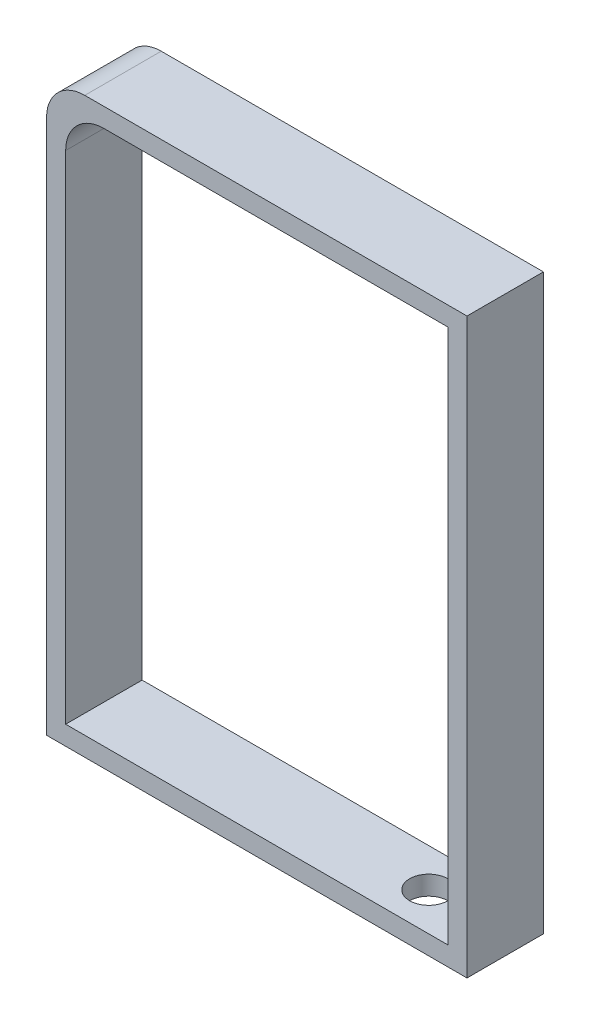
ISO-10303-21;
HEADER;
FILE_DESCRIPTION(('STEP AP214'),'2;1');
FILE_NAME('part.step','',(''),(''),'','','');
FILE_SCHEMA(('AUTOMOTIVE_DESIGN { 1 0 10303 214 1 1 1 1 }'));
ENDSEC;
DATA;
#1=APPLICATION_CONTEXT('core data for automotive mechanical design processes');
#2=APPLICATION_PROTOCOL_DEFINITION('international standard','automotive_design',2000,#1);
#3=PRODUCT_CONTEXT('',#1,'mechanical');
#4=PRODUCT('Part','Part','',(#3));
#5=PRODUCT_RELATED_PRODUCT_CATEGORY('part','',(#4));
#6=PRODUCT_DEFINITION_FORMATION('','',#4);
#7=PRODUCT_DEFINITION_CONTEXT('part definition',#1,'design');
#8=PRODUCT_DEFINITION('design','',#6,#7);
#9=PRODUCT_DEFINITION_SHAPE('','',#8);
#10=(LENGTH_UNIT() NAMED_UNIT(*) SI_UNIT(.MILLI.,.METRE.));
#11=(NAMED_UNIT(*) PLANE_ANGLE_UNIT() SI_UNIT($,.RADIAN.));
#12=(NAMED_UNIT(*) SI_UNIT($,.STERADIAN.) SOLID_ANGLE_UNIT());
#13=UNCERTAINTY_MEASURE_WITH_UNIT(LENGTH_MEASURE(1.E-05),#10,'distance_accuracy_value','');
#14=(GEOMETRIC_REPRESENTATION_CONTEXT(3) GLOBAL_UNCERTAINTY_ASSIGNED_CONTEXT((#13)) GLOBAL_UNIT_ASSIGNED_CONTEXT((#10,
#11,#12)) REPRESENTATION_CONTEXT('',''));
#15=CARTESIAN_POINT('',(0.,0.,0.));
#16=DIRECTION('',(0.,0.,1.));
#17=DIRECTION('',(1.,0.,0.));
#18=AXIS2_PLACEMENT_3D('',#15,#16,#17);
#19=CARTESIAN_POINT('',(27.5,-37.5,10.));
#20=DIRECTION('',(-1.,0.,0.));
#21=DIRECTION('',(0.,0.,1.));
#22=AXIS2_PLACEMENT_3D('',#19,#20,#21);
#23=PLANE('',#22);
#24=DIRECTION('',(0.,1.,0.));
#25=VECTOR('',#24,1.);
#26=CARTESIAN_POINT('',(27.5,-37.5,0.));
#27=LINE('',#26,#25);
#28=CARTESIAN_POINT('',(27.5,-37.5,0.));
#29=VERTEX_POINT('',#28);
#30=CARTESIAN_POINT('',(27.5,37.5,0.));
#31=VERTEX_POINT('',#30);
#32=EDGE_CURVE('E151',#29,#31,#27,.T.);
#33=ORIENTED_EDGE('',*,*,#32,.T.);
#34=DIRECTION('',(0.,0.,-1.));
#35=VECTOR('',#34,1.);
#36=CARTESIAN_POINT('',(27.5,37.5,10.));
#37=LINE('',#36,#35);
#38=CARTESIAN_POINT('',(27.5,37.5,10.));
#39=VERTEX_POINT('',#38);
#40=EDGE_CURVE('E179',#39,#31,#37,.T.);
#41=ORIENTED_EDGE('',*,*,#40,.F.);
#42=DIRECTION('',(0.,1.,0.));
#43=VECTOR('',#42,1.);
#44=CARTESIAN_POINT('',(27.5,-37.5,10.));
#45=LINE('',#44,#43);
#46=CARTESIAN_POINT('',(27.5,-37.5,10.));
#47=VERTEX_POINT('',#46);
#48=EDGE_CURVE('E154',#47,#39,#45,.T.);
#49=ORIENTED_EDGE('',*,*,#48,.F.);
#50=DIRECTION('',(0.,0.,-1.));
#51=VECTOR('',#50,1.);
#52=CARTESIAN_POINT('',(27.5,-37.5,10.));
#53=LINE('',#52,#51);
#54=EDGE_CURVE('E165',#47,#29,#53,.T.);
#55=ORIENTED_EDGE('',*,*,#54,.T.);
#56=EDGE_LOOP('',(#33,#41,#49,#55));
#57=FACE_BOUND('',#56,.T.);
#58=ADVANCED_FACE('F39',(#57),#23,.F.);
#59=CARTESIAN_POINT('',(-27.5,37.5,10.));
#60=DIRECTION('',(0.,-1.,0.));
#61=DIRECTION('',(0.,0.,-1.));
#62=AXIS2_PLACEMENT_3D('',#59,#60,#61);
#63=PLANE('',#62);
#64=DIRECTION('',(-1.,0.,0.));
#65=VECTOR('',#64,1.);
#66=CARTESIAN_POINT('',(-27.5,37.5,0.));
#67=LINE('',#66,#65);
#68=CARTESIAN_POINT('',(-22.5,37.5,0.));
#69=VERTEX_POINT('',#68);
#70=EDGE_CURVE('E168',#31,#69,#67,.T.);
#71=ORIENTED_EDGE('',*,*,#70,.T.);
#72=DIRECTION('',(0.,0.,-1.));
#73=VECTOR('',#72,1.);
#74=CARTESIAN_POINT('',(-22.5,37.5,10.));
#75=LINE('',#74,#73);
#76=CARTESIAN_POINT('',(-22.5,37.5,10.));
#77=VERTEX_POINT('',#76);
#78=EDGE_CURVE('E187',#69,#77,#75,.F.);
#79=ORIENTED_EDGE('',*,*,#78,.T.);
#80=DIRECTION('',(-1.,0.,0.));
#81=VECTOR('',#80,1.);
#82=CARTESIAN_POINT('',(-27.5,37.5,10.));
#83=LINE('',#82,#81);
#84=EDGE_CURVE('E157',#39,#77,#83,.T.);
#85=ORIENTED_EDGE('',*,*,#84,.F.);
#86=ORIENTED_EDGE('',*,*,#40,.T.);
#87=EDGE_LOOP('',(#71,#79,#85,#86));
#88=FACE_BOUND('',#87,.T.);
#89=ADVANCED_FACE('F219',(#88),#63,.F.);
#90=CARTESIAN_POINT('',(-27.5,-37.5,10.));
#91=DIRECTION('',(1.,0.,0.));
#92=DIRECTION('',(0.,0.,-1.));
#93=AXIS2_PLACEMENT_3D('',#90,#91,#92);
#94=PLANE('',#93);
#95=DIRECTION('',(0.,-1.,0.));
#96=VECTOR('',#95,1.);
#97=CARTESIAN_POINT('',(-27.5,-37.5,10.));
#98=LINE('',#97,#96);
#99=CARTESIAN_POINT('',(-27.5,32.5,10.));
#100=VERTEX_POINT('',#99);
#101=CARTESIAN_POINT('',(-27.5,-37.5,10.));
#102=VERTEX_POINT('',#101);
#103=EDGE_CURVE('E161',#100,#102,#98,.T.);
#104=ORIENTED_EDGE('',*,*,#103,.F.);
#105=DIRECTION('',(0.,0.,-1.));
#106=VECTOR('',#105,1.);
#107=CARTESIAN_POINT('',(-27.5,32.5,10.));
#108=LINE('',#107,#106);
#109=CARTESIAN_POINT('',(-27.5,32.5,0.));
#110=VERTEX_POINT('',#109);
#111=EDGE_CURVE('E182',#100,#110,#108,.T.);
#112=ORIENTED_EDGE('',*,*,#111,.T.);
#113=DIRECTION('',(0.,-1.,0.));
#114=VECTOR('',#113,1.);
#115=CARTESIAN_POINT('',(-27.5,-37.5,0.));
#116=LINE('',#115,#114);
#117=CARTESIAN_POINT('',(-27.5,-37.5,0.));
#118=VERTEX_POINT('',#117);
#119=EDGE_CURVE('E171',#110,#118,#116,.T.);
#120=ORIENTED_EDGE('',*,*,#119,.T.);
#121=DIRECTION('',(0.,0.,-1.));
#122=VECTOR('',#121,1.);
#123=CARTESIAN_POINT('',(-27.5,-37.5,10.));
#124=LINE('',#123,#122);
#125=EDGE_CURVE('E176',#102,#118,#124,.T.);
#126=ORIENTED_EDGE('',*,*,#125,.F.);
#127=EDGE_LOOP('',(#104,#112,#120,#126));
#128=FACE_BOUND('',#127,.T.);
#129=ADVANCED_FACE('F225',(#128),#94,.F.);
#130=CARTESIAN_POINT('',(-27.5,-37.5,10.));
#131=DIRECTION('',(0.,1.,0.));
#132=DIRECTION('',(0.,0.,1.));
#133=AXIS2_PLACEMENT_3D('',#130,#131,#132);
#134=PLANE('',#133);
#135=CARTESIAN_POINT('',(17.5,-37.5,5.));
#136=DIRECTION('',(0.,1.,0.));
#137=DIRECTION('',(0.,0.,1.));
#138=AXIS2_PLACEMENT_3D('',#135,#136,#137);
#139=CIRCLE('',#138,2.49999999999999);
#140=CARTESIAN_POINT('',(17.5,-37.5,7.49999999999999));
#141=VERTEX_POINT('',#140);
#142=EDGE_CURVE('E264',#141,#141,#139,.T.);
#143=ORIENTED_EDGE('',*,*,#142,.T.);
#144=EDGE_LOOP('',(#143));
#145=FACE_BOUND('',#144,.T.);
#146=DIRECTION('',(1.,0.,0.));
#147=VECTOR('',#146,1.);
#148=CARTESIAN_POINT('',(-27.5,-37.5,0.));
#149=LINE('',#148,#147);
#150=EDGE_CURVE('E158',#118,#29,#149,.T.);
#151=ORIENTED_EDGE('',*,*,#150,.T.);
#152=ORIENTED_EDGE('',*,*,#54,.F.);
#153=DIRECTION('',(1.,0.,0.));
#154=VECTOR('',#153,1.);
#155=CARTESIAN_POINT('',(-27.5,-37.5,10.));
#156=LINE('',#155,#154);
#157=EDGE_CURVE('E163',#102,#47,#156,.T.);
#158=ORIENTED_EDGE('',*,*,#157,.F.);
#159=ORIENTED_EDGE('',*,*,#125,.T.);
#160=EDGE_LOOP('',(#151,#152,#158,#159));
#161=FACE_BOUND('',#160,.T.);
#162=ADVANCED_FACE('F231',(#145,#161),#134,.F.);
#163=CARTESIAN_POINT('',(0.,0.,10.));
#164=DIRECTION('',(0.,0.,-1.));
#165=DIRECTION('',(-1.,0.,0.));
#166=AXIS2_PLACEMENT_3D('',#163,#164,#165);
#167=PLANE('',#166);
#168=DIRECTION('',(-1.,0.,0.));
#169=VECTOR('',#168,1.);
#170=CARTESIAN_POINT('',(25.,-35.,10.));
#171=LINE('',#170,#169);
#172=CARTESIAN_POINT('',(25.,-35.,10.));
#173=VERTEX_POINT('',#172);
#174=CARTESIAN_POINT('',(-25.,-35.,10.));
#175=VERTEX_POINT('',#174);
#176=EDGE_CURVE('E132',#173,#175,#171,.T.);
#177=ORIENTED_EDGE('',*,*,#176,.T.);
#178=DIRECTION('',(0.,1.,0.));
#179=VECTOR('',#178,1.);
#180=CARTESIAN_POINT('',(-25.,35.,10.));
#181=LINE('',#180,#179);
#182=CARTESIAN_POINT('',(-25.,30.,10.));
#183=VERTEX_POINT('',#182);
#184=EDGE_CURVE('E139',#175,#183,#181,.T.);
#185=ORIENTED_EDGE('',*,*,#184,.T.);
#186=CARTESIAN_POINT('',(-20.,30.,10.));
#187=DIRECTION('',(0.,0.,-1.));
#188=DIRECTION('',(-1.,0.,0.));
#189=AXIS2_PLACEMENT_3D('',#186,#187,#188);
#190=CIRCLE('',#189,5.);
#191=CARTESIAN_POINT('',(-20.,35.,10.));
#192=VERTEX_POINT('',#191);
#193=EDGE_CURVE('E11',#183,#192,#190,.T.);
#194=ORIENTED_EDGE('',*,*,#193,.T.);
#195=DIRECTION('',(1.,0.,0.));
#196=VECTOR('',#195,1.);
#197=CARTESIAN_POINT('',(25.,35.,10.));
#198=LINE('',#197,#196);
#199=CARTESIAN_POINT('',(25.,35.,10.));
#200=VERTEX_POINT('',#199);
#201=EDGE_CURVE('E137',#192,#200,#198,.T.);
#202=ORIENTED_EDGE('',*,*,#201,.T.);
#203=DIRECTION('',(0.,-1.,0.));
#204=VECTOR('',#203,1.);
#205=CARTESIAN_POINT('',(25.,35.,10.));
#206=LINE('',#205,#204);
#207=EDGE_CURVE('E121',#200,#173,#206,.T.);
#208=ORIENTED_EDGE('',*,*,#207,.T.);
#209=EDGE_LOOP('',(#177,#185,#194,#202,#208));
#210=FACE_BOUND('',#209,.T.);
#211=ORIENTED_EDGE('',*,*,#84,.T.);
#212=CARTESIAN_POINT('',(-22.5,32.5,10.));
#213=DIRECTION('',(0.,0.,-1.));
#214=DIRECTION('',(-1.,0.,0.));
#215=AXIS2_PLACEMENT_3D('',#212,#213,#214);
#216=CIRCLE('',#215,5.);
#217=EDGE_CURVE('E189',#77,#100,#216,.F.);
#218=ORIENTED_EDGE('',*,*,#217,.T.);
#219=ORIENTED_EDGE('',*,*,#103,.T.);
#220=ORIENTED_EDGE('',*,*,#157,.T.);
#221=ORIENTED_EDGE('',*,*,#48,.T.);
#222=EDGE_LOOP('',(#211,#218,#219,#220,#221));
#223=FACE_BOUND('',#222,.T.);
#224=ADVANCED_FACE('F135',(#210,#223),#167,.F.);
#225=CARTESIAN_POINT('',(0.,0.,0.));
#226=DIRECTION('',(0.,0.,-1.));
#227=DIRECTION('',(-1.,0.,0.));
#228=AXIS2_PLACEMENT_3D('',#225,#226,#227);
#229=PLANE('',#228);
#230=DIRECTION('',(0.,1.,0.));
#231=VECTOR('',#230,1.);
#232=CARTESIAN_POINT('',(-25.,35.,0.));
#233=LINE('',#232,#231);
#234=CARTESIAN_POINT('',(-25.,-35.,0.));
#235=VERTEX_POINT('',#234);
#236=CARTESIAN_POINT('',(-25.,30.,0.));
#237=VERTEX_POINT('',#236);
#238=EDGE_CURVE('E143',#235,#237,#233,.T.);
#239=ORIENTED_EDGE('',*,*,#238,.F.);
#240=DIRECTION('',(-1.,0.,0.));
#241=VECTOR('',#240,1.);
#242=CARTESIAN_POINT('',(25.,-35.,0.));
#243=LINE('',#242,#241);
#244=CARTESIAN_POINT('',(25.,-35.,0.));
#245=VERTEX_POINT('',#244);
#246=EDGE_CURVE('E149',#245,#235,#243,.T.);
#247=ORIENTED_EDGE('',*,*,#246,.F.);
#248=DIRECTION('',(0.,-1.,0.));
#249=VECTOR('',#248,1.);
#250=CARTESIAN_POINT('',(25.,35.,0.));
#251=LINE('',#250,#249);
#252=CARTESIAN_POINT('',(25.,35.,0.));
#253=VERTEX_POINT('',#252);
#254=EDGE_CURVE('E124',#253,#245,#251,.T.);
#255=ORIENTED_EDGE('',*,*,#254,.F.);
#256=DIRECTION('',(1.,0.,0.));
#257=VECTOR('',#256,1.);
#258=CARTESIAN_POINT('',(25.,35.,0.));
#259=LINE('',#258,#257);
#260=CARTESIAN_POINT('',(-20.,35.,0.));
#261=VERTEX_POINT('',#260);
#262=EDGE_CURVE('E145',#261,#253,#259,.T.);
#263=ORIENTED_EDGE('',*,*,#262,.F.);
#264=CARTESIAN_POINT('',(-20.,30.,0.));
#265=DIRECTION('',(0.,0.,-1.));
#266=DIRECTION('',(-1.,0.,0.));
#267=AXIS2_PLACEMENT_3D('',#264,#265,#266);
#268=CIRCLE('',#267,5.);
#269=EDGE_CURVE('E47',#261,#237,#268,.F.);
#270=ORIENTED_EDGE('',*,*,#269,.T.);
#271=EDGE_LOOP('',(#239,#247,#255,#263,#270));
#272=FACE_BOUND('',#271,.T.);
#273=ORIENTED_EDGE('',*,*,#119,.F.);
#274=CARTESIAN_POINT('',(-22.5,32.5,0.));
#275=DIRECTION('',(0.,0.,-1.));
#276=DIRECTION('',(-1.,0.,0.));
#277=AXIS2_PLACEMENT_3D('',#274,#275,#276);
#278=CIRCLE('',#277,5.);
#279=EDGE_CURVE('E185',#110,#69,#278,.T.);
#280=ORIENTED_EDGE('',*,*,#279,.T.);
#281=ORIENTED_EDGE('',*,*,#70,.F.);
#282=ORIENTED_EDGE('',*,*,#32,.F.);
#283=ORIENTED_EDGE('',*,*,#150,.F.);
#284=EDGE_LOOP('',(#273,#280,#281,#282,#283));
#285=FACE_BOUND('',#284,.T.);
#286=ADVANCED_FACE('F197',(#272,#285),#229,.T.);
#287=CARTESIAN_POINT('',(-25.,35.,10.));
#288=DIRECTION('',(-1.,0.,0.));
#289=DIRECTION('',(0.,-1.,0.));
#290=AXIS2_PLACEMENT_3D('',#287,#288,#289);
#291=PLANE('',#290);
#292=ORIENTED_EDGE('',*,*,#238,.T.);
#293=DIRECTION('',(0.,0.,-1.));
#294=VECTOR('',#293,1.);
#295=CARTESIAN_POINT('',(-25.,30.,10.));
#296=LINE('',#295,#294);
#297=EDGE_CURVE('E60',#237,#183,#296,.F.);
#298=ORIENTED_EDGE('',*,*,#297,.T.);
#299=ORIENTED_EDGE('',*,*,#184,.F.);
#300=DIRECTION('',(0.,0.,-1.));
#301=VECTOR('',#300,1.);
#302=CARTESIAN_POINT('',(-25.,-35.,10.));
#303=LINE('',#302,#301);
#304=EDGE_CURVE('E128',#175,#235,#303,.T.);
#305=ORIENTED_EDGE('',*,*,#304,.T.);
#306=EDGE_LOOP('',(#292,#298,#299,#305));
#307=FACE_BOUND('',#306,.T.);
#308=ADVANCED_FACE('F201',(#307),#291,.F.);
#309=CARTESIAN_POINT('',(25.,-35.,10.));
#310=DIRECTION('',(0.,-1.,0.));
#311=DIRECTION('',(0.,0.,-1.));
#312=AXIS2_PLACEMENT_3D('',#309,#310,#311);
#313=PLANE('',#312);
#314=CARTESIAN_POINT('',(17.5,-35.,5.));
#315=DIRECTION('',(0.,1.,0.));
#316=DIRECTION('',(0.,0.,1.));
#317=AXIS2_PLACEMENT_3D('',#314,#315,#316);
#318=CIRCLE('',#317,2.49999999999999);
#319=CARTESIAN_POINT('',(17.5,-35.,7.49999999999999));
#320=VERTEX_POINT('',#319);
#321=EDGE_CURVE('E266',#320,#320,#318,.T.);
#322=ORIENTED_EDGE('',*,*,#321,.F.);
#323=EDGE_LOOP('',(#322));
#324=FACE_BOUND('',#323,.T.);
#325=ORIENTED_EDGE('',*,*,#246,.T.);
#326=ORIENTED_EDGE('',*,*,#304,.F.);
#327=ORIENTED_EDGE('',*,*,#176,.F.);
#328=DIRECTION('',(0.,0.,-1.));
#329=VECTOR('',#328,1.);
#330=CARTESIAN_POINT('',(25.,-35.,10.));
#331=LINE('',#330,#329);
#332=EDGE_CURVE('E116',#173,#245,#331,.T.);
#333=ORIENTED_EDGE('',*,*,#332,.T.);
#334=EDGE_LOOP('',(#325,#326,#327,#333));
#335=FACE_BOUND('',#334,.T.);
#336=ADVANCED_FACE('F133',(#324,#335),#313,.F.);
#337=CARTESIAN_POINT('',(25.,35.,10.));
#338=DIRECTION('',(1.,0.,0.));
#339=DIRECTION('',(0.,1.,0.));
#340=AXIS2_PLACEMENT_3D('',#337,#338,#339);
#341=PLANE('',#340);
#342=ORIENTED_EDGE('',*,*,#254,.T.);
#343=ORIENTED_EDGE('',*,*,#332,.F.);
#344=ORIENTED_EDGE('',*,*,#207,.F.);
#345=DIRECTION('',(0.,0.,-1.));
#346=VECTOR('',#345,1.);
#347=CARTESIAN_POINT('',(25.,35.,10.));
#348=LINE('',#347,#346);
#349=EDGE_CURVE('E129',#200,#253,#348,.T.);
#350=ORIENTED_EDGE('',*,*,#349,.T.);
#351=EDGE_LOOP('',(#342,#343,#344,#350));
#352=FACE_BOUND('',#351,.T.);
#353=ADVANCED_FACE('F118',(#352),#341,.F.);
#354=CARTESIAN_POINT('',(25.,35.,10.));
#355=DIRECTION('',(0.,1.,0.));
#356=DIRECTION('',(-1.,0.,0.));
#357=AXIS2_PLACEMENT_3D('',#354,#355,#356);
#358=PLANE('',#357);
#359=CARTESIAN_POINT('',(17.5,35.,5.));
#360=DIRECTION('',(0.,-1.,0.));
#361=DIRECTION('',(1.,0.,0.));
#362=AXIS2_PLACEMENT_3D('',#359,#360,#361);
#363=CIRCLE('',#362,2.5);
#364=CARTESIAN_POINT('',(20.,35.,5.));
#365=VERTEX_POINT('',#364);
#366=EDGE_CURVE('E268',#365,#365,#363,.T.);
#367=ORIENTED_EDGE('',*,*,#366,.F.);
#368=EDGE_LOOP('',(#367));
#369=FACE_BOUND('',#368,.T.);
#370=ORIENTED_EDGE('',*,*,#201,.F.);
#371=DIRECTION('',(0.,0.,-1.));
#372=VECTOR('',#371,1.);
#373=CARTESIAN_POINT('',(-20.,35.,0.));
#374=LINE('',#373,#372);
#375=EDGE_CURVE('E191',#192,#261,#374,.T.);
#376=ORIENTED_EDGE('',*,*,#375,.T.);
#377=ORIENTED_EDGE('',*,*,#262,.T.);
#378=ORIENTED_EDGE('',*,*,#349,.F.);
#379=EDGE_LOOP('',(#370,#376,#377,#378));
#380=FACE_BOUND('',#379,.T.);
#381=ADVANCED_FACE('F203',(#369,#380),#358,.F.);
#382=CARTESIAN_POINT('',(-22.5,32.5,10.));
#383=DIRECTION('',(0.,0.,-1.));
#384=DIRECTION('',(-1.,0.,0.));
#385=AXIS2_PLACEMENT_3D('',#382,#383,#384);
#386=CYLINDRICAL_SURFACE('',#385,5.);
#387=ORIENTED_EDGE('',*,*,#217,.F.);
#388=ORIENTED_EDGE('',*,*,#78,.F.);
#389=ORIENTED_EDGE('',*,*,#279,.F.);
#390=ORIENTED_EDGE('',*,*,#111,.F.);
#391=EDGE_LOOP('',(#387,#388,#389,#390));
#392=FACE_BOUND('',#391,.T.);
#393=ADVANCED_FACE('F205',(#392),#386,.T.);
#394=CARTESIAN_POINT('',(-20.,30.,10.));
#395=DIRECTION('',(0.,0.,1.));
#396=DIRECTION('',(1.,0.,0.));
#397=AXIS2_PLACEMENT_3D('',#394,#395,#396);
#398=CYLINDRICAL_SURFACE('',#397,5.);
#399=ORIENTED_EDGE('',*,*,#193,.F.);
#400=ORIENTED_EDGE('',*,*,#297,.F.);
#401=ORIENTED_EDGE('',*,*,#269,.F.);
#402=ORIENTED_EDGE('',*,*,#375,.F.);
#403=EDGE_LOOP('',(#399,#400,#401,#402));
#404=FACE_BOUND('',#403,.T.);
#405=ADVANCED_FACE('F41',(#404),#398,.F.);
#406=CARTESIAN_POINT('',(17.5,36.5,5.));
#407=DIRECTION('',(0.,-1.,0.));
#408=DIRECTION('',(1.,0.,0.));
#409=AXIS2_PLACEMENT_3D('',#406,#407,#408);
#410=CYLINDRICAL_SURFACE('',#409,2.5);
#411=CARTESIAN_POINT('',(17.5,36.5,5.));
#412=DIRECTION('',(0.,-1.,0.));
#413=DIRECTION('',(1.,0.,0.));
#414=AXIS2_PLACEMENT_3D('',#411,#412,#413);
#415=CIRCLE('',#414,2.5);
#416=CARTESIAN_POINT('',(20.,36.5,5.));
#417=VERTEX_POINT('',#416);
#418=EDGE_CURVE('E146',#417,#417,#415,.T.);
#419=ORIENTED_EDGE('',*,*,#418,.F.);
#420=EDGE_LOOP('',(#419));
#421=FACE_BOUND('',#420,.T.);
#422=ORIENTED_EDGE('',*,*,#366,.T.);
#423=EDGE_LOOP('',(#422));
#424=FACE_BOUND('',#423,.T.);
#425=ADVANCED_FACE('F250',(#421,#424),#410,.F.);
#426=CARTESIAN_POINT('',(17.5,36.5,5.));
#427=DIRECTION('',(0.,-1.,0.));
#428=DIRECTION('',(1.,0.,0.));
#429=AXIS2_PLACEMENT_3D('',#426,#427,#428);
#430=PLANE('',#429);
#431=ORIENTED_EDGE('',*,*,#418,.T.);
#432=EDGE_LOOP('',(#431));
#433=FACE_BOUND('',#432,.T.);
#434=ADVANCED_FACE('F252',(#433),#430,.T.);
#435=CARTESIAN_POINT('',(17.5,-37.5,5.));
#436=DIRECTION('',(0.,1.,0.));
#437=DIRECTION('',(0.,0.,1.));
#438=AXIS2_PLACEMENT_3D('',#435,#436,#437);
#439=CYLINDRICAL_SURFACE('',#438,2.49999999999999);
#440=ORIENTED_EDGE('',*,*,#142,.F.);
#441=EDGE_LOOP('',(#440));
#442=FACE_BOUND('',#441,.T.);
#443=ORIENTED_EDGE('',*,*,#321,.T.);
#444=EDGE_LOOP('',(#443));
#445=FACE_BOUND('',#444,.T.);
#446=ADVANCED_FACE('F256',(#442,#445),#439,.F.);
#447=CLOSED_SHELL('',(#58,#89,#129,#162,#224,#286,#308,#336,#353,#381,#393,#405,#425,#434,#446));
#448=MANIFOLD_SOLID_BREP('B2',#447);
#449=ADVANCED_BREP_SHAPE_REPRESENTATION('',(#18,#448),#14);
#450=SHAPE_DEFINITION_REPRESENTATION(#9,#449);
ENDSEC;
END-ISO-10303-21;
